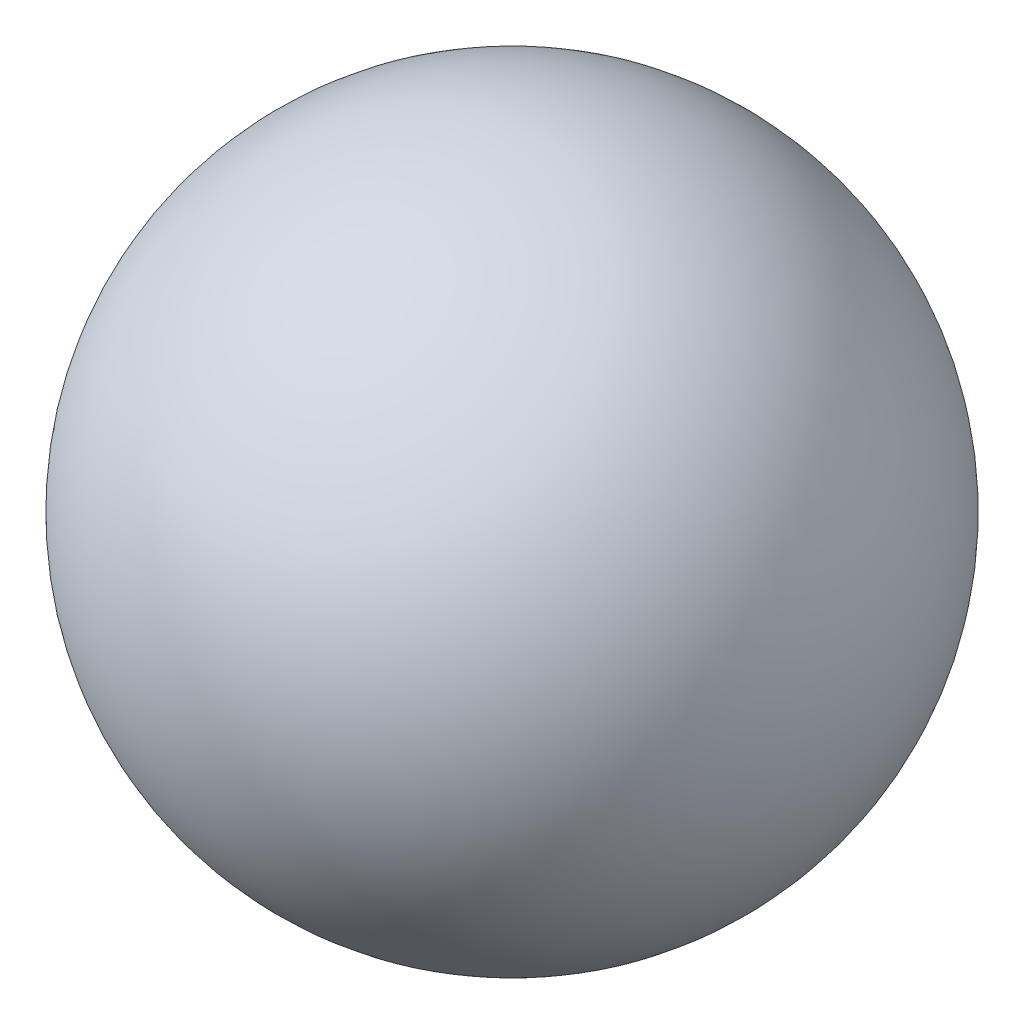
ISO-10303-21;
HEADER;
FILE_DESCRIPTION(('STEP AP214'),'2;1');
FILE_NAME('part.step','',(''),(''),'','','');
FILE_SCHEMA(('AUTOMOTIVE_DESIGN { 1 0 10303 214 1 1 1 1 }'));
ENDSEC;
DATA;
#1=APPLICATION_CONTEXT('core data for automotive mechanical design processes');
#2=APPLICATION_PROTOCOL_DEFINITION('international standard','automotive_design',2000,#1);
#3=PRODUCT_CONTEXT('',#1,'mechanical');
#4=PRODUCT('Part','Part','',(#3));
#5=PRODUCT_RELATED_PRODUCT_CATEGORY('part','',(#4));
#6=PRODUCT_DEFINITION_FORMATION('','',#4);
#7=PRODUCT_DEFINITION_CONTEXT('part definition',#1,'design');
#8=PRODUCT_DEFINITION('design','',#6,#7);
#9=PRODUCT_DEFINITION_SHAPE('','',#8);
#10=(LENGTH_UNIT() NAMED_UNIT(*) SI_UNIT(.MILLI.,.METRE.));
#11=(NAMED_UNIT(*) PLANE_ANGLE_UNIT() SI_UNIT($,.RADIAN.));
#12=(NAMED_UNIT(*) SI_UNIT($,.STERADIAN.) SOLID_ANGLE_UNIT());
#13=UNCERTAINTY_MEASURE_WITH_UNIT(LENGTH_MEASURE(1.E-05),#10,'distance_accuracy_value','');
#14=(GEOMETRIC_REPRESENTATION_CONTEXT(3) GLOBAL_UNCERTAINTY_ASSIGNED_CONTEXT((#13)) GLOBAL_UNIT_ASSIGNED_CONTEXT((#10,
#11,#12)) REPRESENTATION_CONTEXT('',''));
#15=CARTESIAN_POINT('',(0.,0.,0.));
#16=DIRECTION('',(0.,0.,1.));
#17=DIRECTION('',(1.,0.,0.));
#18=AXIS2_PLACEMENT_3D('',#15,#16,#17);
#19=CARTESIAN_POINT('',(0.,0.,0.));
#20=DIRECTION('',(0.,-1.,0.));
#21=DIRECTION('',(0.,0.,-1.));
#22=AXIS2_PLACEMENT_3D('',#19,#20,#21);
#23=SPHERICAL_SURFACE('',#22,8.15);
#24=CARTESIAN_POINT('',(0.,-8.15,0.));
#25=VERTEX_POINT('',#24);
#26=VERTEX_LOOP('',#25);
#27=FACE_BOUND('',#26,.T.);
#28=ADVANCED_FACE('F28',(#27),#23,.T.);
#29=CLOSED_SHELL('',(#28));
#30=MANIFOLD_SOLID_BREP('B2',#29);
#31=ADVANCED_BREP_SHAPE_REPRESENTATION('',(#18,#30),#14);
#32=SHAPE_DEFINITION_REPRESENTATION(#9,#31);
ENDSEC;
END-ISO-10303-21;
